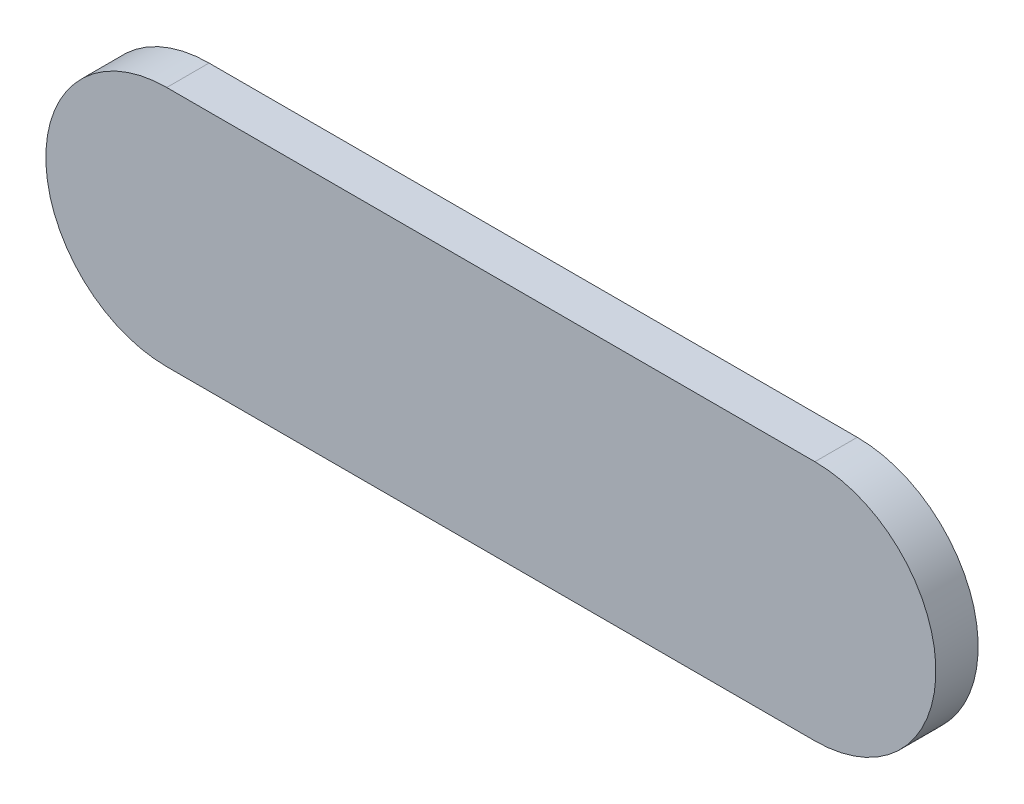
ISO-10303-21;
HEADER;
FILE_DESCRIPTION(('STEP AP214'),'2;1');
FILE_NAME('part.step','',(''),(''),'','','');
FILE_SCHEMA(('AUTOMOTIVE_DESIGN { 1 0 10303 214 1 1 1 1 }'));
ENDSEC;
DATA;
#1=APPLICATION_CONTEXT('core data for automotive mechanical design processes');
#2=APPLICATION_PROTOCOL_DEFINITION('international standard','automotive_design',2000,#1);
#3=PRODUCT_CONTEXT('',#1,'mechanical');
#4=PRODUCT('Part','Part','',(#3));
#5=PRODUCT_RELATED_PRODUCT_CATEGORY('part','',(#4));
#6=PRODUCT_DEFINITION_FORMATION('','',#4);
#7=PRODUCT_DEFINITION_CONTEXT('part definition',#1,'design');
#8=PRODUCT_DEFINITION('design','',#6,#7);
#9=PRODUCT_DEFINITION_SHAPE('','',#8);
#10=(LENGTH_UNIT() NAMED_UNIT(*) SI_UNIT(.MILLI.,.METRE.));
#11=(NAMED_UNIT(*) PLANE_ANGLE_UNIT() SI_UNIT($,.RADIAN.));
#12=(NAMED_UNIT(*) SI_UNIT($,.STERADIAN.) SOLID_ANGLE_UNIT());
#13=UNCERTAINTY_MEASURE_WITH_UNIT(LENGTH_MEASURE(1.E-05),#10,'distance_accuracy_value','');
#14=(GEOMETRIC_REPRESENTATION_CONTEXT(3) GLOBAL_UNCERTAINTY_ASSIGNED_CONTEXT((#13)) GLOBAL_UNIT_ASSIGNED_CONTEXT((#10,
#11,#12)) REPRESENTATION_CONTEXT('',''));
#15=CARTESIAN_POINT('',(0.,0.,0.));
#16=DIRECTION('',(0.,0.,1.));
#17=DIRECTION('',(1.,0.,0.));
#18=AXIS2_PLACEMENT_3D('',#15,#16,#17);
#19=CARTESIAN_POINT('',(89.011078,-118.6,1.635));
#20=DIRECTION('',(0.,0.,1.));
#21=DIRECTION('',(1.,0.,0.));
#22=AXIS2_PLACEMENT_3D('',#19,#20,#21);
#23=PLANE('',#22);
#24=DIRECTION('',(-1.,0.,0.));
#25=VECTOR('',#24,1.);
#26=CARTESIAN_POINT('',(89.011078,-118.6,1.635));
#27=LINE('',#26,#25);
#28=CARTESIAN_POINT('',(89.011078,-118.6,1.635));
#29=VERTEX_POINT('',#28);
#30=CARTESIAN_POINT('',(88.475,-118.6,1.635));
#31=VERTEX_POINT('',#30);
#32=EDGE_CURVE('E81',#29,#31,#27,.T.);
#33=ORIENTED_EDGE('',*,*,#32,.T.);
#34=CARTESIAN_POINT('',(88.475,-118.7,1.635));
#35=DIRECTION('',(0.,0.,1.));
#36=DIRECTION('',(0.,1.,0.));
#37=AXIS2_PLACEMENT_3D('',#34,#35,#36);
#38=CIRCLE('',#37,0.1);
#39=CARTESIAN_POINT('',(88.475,-118.8,1.635));
#40=VERTEX_POINT('',#39);
#41=EDGE_CURVE('E101',#31,#40,#38,.T.);
#42=ORIENTED_EDGE('',*,*,#41,.T.);
#43=DIRECTION('',(1.,0.,0.));
#44=VECTOR('',#43,1.);
#45=CARTESIAN_POINT('',(88.475,-118.8,1.635));
#46=LINE('',#45,#44);
#47=CARTESIAN_POINT('',(89.011078,-118.8,1.635));
#48=VERTEX_POINT('',#47);
#49=EDGE_CURVE('E74',#40,#48,#46,.T.);
#50=ORIENTED_EDGE('',*,*,#49,.T.);
#51=CARTESIAN_POINT('',(89.011078,-118.7,1.635));
#52=DIRECTION('',(0.,0.,1.));
#53=DIRECTION('',(-1.42108547152E-13,-1.,0.));
#54=AXIS2_PLACEMENT_3D('',#51,#52,#53);
#55=CIRCLE('',#54,0.1);
#56=EDGE_CURVE('E11',#48,#29,#55,.T.);
#57=ORIENTED_EDGE('',*,*,#56,.T.);
#58=EDGE_LOOP('',(#33,#42,#50,#57));
#59=FACE_BOUND('',#58,.T.);
#60=ADVANCED_FACE('F17',(#59),#23,.T.);
#61=CARTESIAN_POINT('',(89.011078,-118.6,1.6));
#62=DIRECTION('',(0.,0.,1.));
#63=DIRECTION('',(1.,0.,0.));
#64=AXIS2_PLACEMENT_3D('',#61,#62,#63);
#65=PLANE('',#64);
#66=CARTESIAN_POINT('',(89.011078,-118.7,1.6));
#67=DIRECTION('',(0.,0.,1.));
#68=DIRECTION('',(-1.42108547152E-13,-1.,0.));
#69=AXIS2_PLACEMENT_3D('',#66,#67,#68);
#70=CIRCLE('',#69,0.1);
#71=CARTESIAN_POINT('',(89.011078,-118.8,1.6));
#72=VERTEX_POINT('',#71);
#73=CARTESIAN_POINT('',(89.011078,-118.6,1.6));
#74=VERTEX_POINT('',#73);
#75=EDGE_CURVE('E25',#72,#74,#70,.T.);
#76=ORIENTED_EDGE('',*,*,#75,.F.);
#77=DIRECTION('',(1.,0.,0.));
#78=VECTOR('',#77,1.);
#79=CARTESIAN_POINT('',(88.475,-118.8,1.6));
#80=LINE('',#79,#78);
#81=CARTESIAN_POINT('',(88.475,-118.8,1.6));
#82=VERTEX_POINT('',#81);
#83=EDGE_CURVE('E98',#82,#72,#80,.T.);
#84=ORIENTED_EDGE('',*,*,#83,.F.);
#85=CARTESIAN_POINT('',(88.475,-118.7,1.6));
#86=DIRECTION('',(0.,0.,1.));
#87=DIRECTION('',(0.,1.,0.));
#88=AXIS2_PLACEMENT_3D('',#85,#86,#87);
#89=CIRCLE('',#88,0.1);
#90=CARTESIAN_POINT('',(88.475,-118.6,1.6));
#91=VERTEX_POINT('',#90);
#92=EDGE_CURVE('E83',#91,#82,#89,.T.);
#93=ORIENTED_EDGE('',*,*,#92,.F.);
#94=DIRECTION('',(-1.,0.,0.));
#95=VECTOR('',#94,1.);
#96=CARTESIAN_POINT('',(89.011078,-118.6,1.6));
#97=LINE('',#96,#95);
#98=EDGE_CURVE('E79',#74,#91,#97,.T.);
#99=ORIENTED_EDGE('',*,*,#98,.F.);
#100=EDGE_LOOP('',(#76,#84,#93,#99));
#101=FACE_BOUND('',#100,.T.);
#102=ADVANCED_FACE('F85',(#101),#65,.F.);
#103=CARTESIAN_POINT('',(89.011078,-118.7,1.6));
#104=DIRECTION('',(0.,0.,-1.));
#105=DIRECTION('',(-1.42108547152E-13,-1.,0.));
#106=AXIS2_PLACEMENT_3D('',#103,#104,#105);
#107=CYLINDRICAL_SURFACE('',#106,0.1);
#108=ORIENTED_EDGE('',*,*,#75,.T.);
#109=DIRECTION('',(0.,0.,1.));
#110=VECTOR('',#109,1.);
#111=CARTESIAN_POINT('',(89.011078,-118.6,1.6));
#112=LINE('',#111,#110);
#113=EDGE_CURVE('E68',#74,#29,#112,.T.);
#114=ORIENTED_EDGE('',*,*,#113,.T.);
#115=ORIENTED_EDGE('',*,*,#56,.F.);
#116=DIRECTION('',(0.,0.,1.));
#117=VECTOR('',#116,1.);
#118=CARTESIAN_POINT('',(89.011078,-118.8,1.6));
#119=LINE('',#118,#117);
#120=EDGE_CURVE('E71',#72,#48,#119,.T.);
#121=ORIENTED_EDGE('',*,*,#120,.F.);
#122=EDGE_LOOP('',(#108,#114,#115,#121));
#123=FACE_BOUND('',#122,.T.);
#124=ADVANCED_FACE('F67',(#123),#107,.T.);
#125=CARTESIAN_POINT('',(88.475,-118.8,1.6));
#126=DIRECTION('',(0.,1.,0.));
#127=DIRECTION('',(1.,0.,0.));
#128=AXIS2_PLACEMENT_3D('',#125,#126,#127);
#129=PLANE('',#128);
#130=ORIENTED_EDGE('',*,*,#83,.T.);
#131=ORIENTED_EDGE('',*,*,#120,.T.);
#132=ORIENTED_EDGE('',*,*,#49,.F.);
#133=DIRECTION('',(0.,0.,1.));
#134=VECTOR('',#133,1.);
#135=CARTESIAN_POINT('',(88.475,-118.8,1.6));
#136=LINE('',#135,#134);
#137=EDGE_CURVE('E106',#82,#40,#136,.T.);
#138=ORIENTED_EDGE('',*,*,#137,.F.);
#139=EDGE_LOOP('',(#130,#131,#132,#138));
#140=FACE_BOUND('',#139,.T.);
#141=ADVANCED_FACE('F122',(#140),#129,.F.);
#142=CARTESIAN_POINT('',(88.475,-118.7,1.6));
#143=DIRECTION('',(0.,0.,-1.));
#144=DIRECTION('',(0.,1.,0.));
#145=AXIS2_PLACEMENT_3D('',#142,#143,#144);
#146=CYLINDRICAL_SURFACE('',#145,0.1);
#147=ORIENTED_EDGE('',*,*,#92,.T.);
#148=ORIENTED_EDGE('',*,*,#137,.T.);
#149=ORIENTED_EDGE('',*,*,#41,.F.);
#150=DIRECTION('',(0.,0.,1.));
#151=VECTOR('',#150,1.);
#152=CARTESIAN_POINT('',(88.475,-118.6,1.6));
#153=LINE('',#152,#151);
#154=EDGE_CURVE('E89',#91,#31,#153,.T.);
#155=ORIENTED_EDGE('',*,*,#154,.F.);
#156=EDGE_LOOP('',(#147,#148,#149,#155));
#157=FACE_BOUND('',#156,.T.);
#158=ADVANCED_FACE('F124',(#157),#146,.T.);
#159=CARTESIAN_POINT('',(89.011078,-118.6,1.6));
#160=DIRECTION('',(0.,-1.,0.));
#161=DIRECTION('',(0.,0.,-1.));
#162=AXIS2_PLACEMENT_3D('',#159,#160,#161);
#163=PLANE('',#162);
#164=ORIENTED_EDGE('',*,*,#98,.T.);
#165=ORIENTED_EDGE('',*,*,#154,.T.);
#166=ORIENTED_EDGE('',*,*,#32,.F.);
#167=ORIENTED_EDGE('',*,*,#113,.F.);
#168=EDGE_LOOP('',(#164,#165,#166,#167));
#169=FACE_BOUND('',#168,.T.);
#170=ADVANCED_FACE('F77',(#169),#163,.F.);
#171=CLOSED_SHELL('',(#60,#102,#124,#141,#158,#170));
#172=MANIFOLD_SOLID_BREP('B1',#171);
#173=ADVANCED_BREP_SHAPE_REPRESENTATION('',(#18,#172),#14);
#174=SHAPE_DEFINITION_REPRESENTATION(#9,#173);
ENDSEC;
END-ISO-10303-21;
